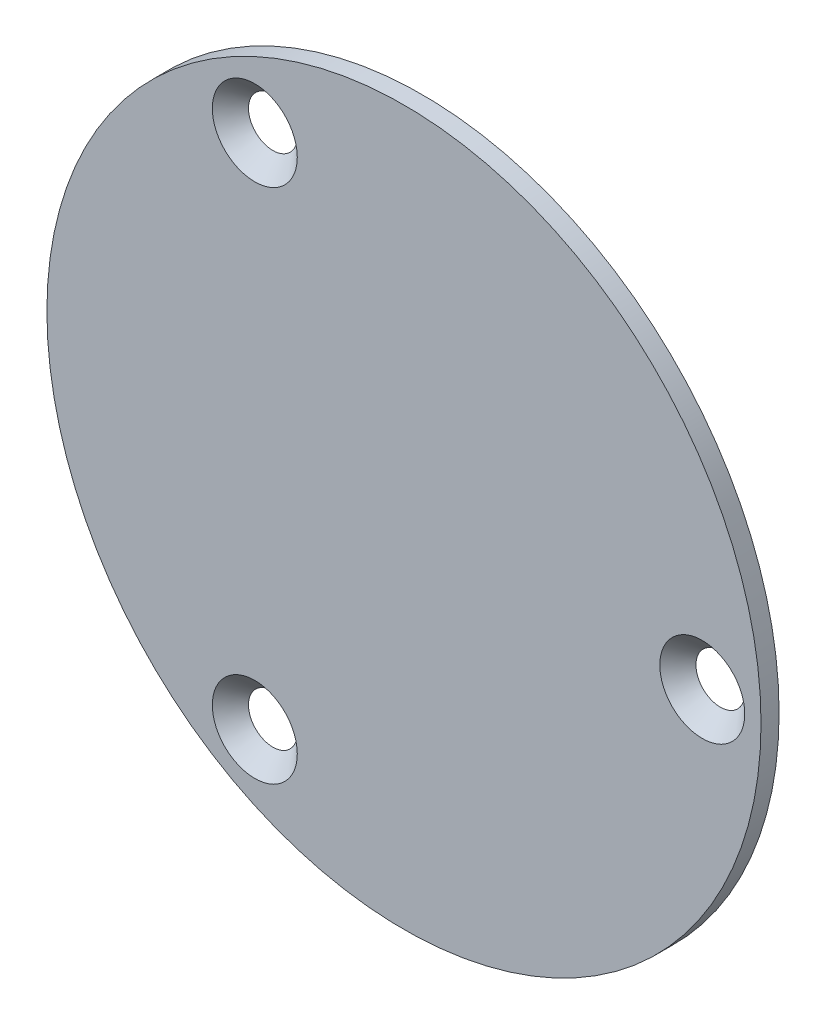
ISO-10303-21;
HEADER;
FILE_DESCRIPTION(('STEP AP214'),'2;1');
FILE_NAME('part.step','',(''),(''),'','','');
FILE_SCHEMA(('AUTOMOTIVE_DESIGN { 1 0 10303 214 1 1 1 1 }'));
ENDSEC;
DATA;
#1=APPLICATION_CONTEXT('core data for automotive mechanical design processes');
#2=APPLICATION_PROTOCOL_DEFINITION('international standard','automotive_design',2000,#1);
#3=PRODUCT_CONTEXT('',#1,'mechanical');
#4=PRODUCT('Part','Part','',(#3));
#5=PRODUCT_RELATED_PRODUCT_CATEGORY('part','',(#4));
#6=PRODUCT_DEFINITION_FORMATION('','',#4);
#7=PRODUCT_DEFINITION_CONTEXT('part definition',#1,'design');
#8=PRODUCT_DEFINITION('design','',#6,#7);
#9=PRODUCT_DEFINITION_SHAPE('','',#8);
#10=(LENGTH_UNIT() NAMED_UNIT(*) SI_UNIT(.MILLI.,.METRE.));
#11=(NAMED_UNIT(*) PLANE_ANGLE_UNIT() SI_UNIT($,.RADIAN.));
#12=(NAMED_UNIT(*) SI_UNIT($,.STERADIAN.) SOLID_ANGLE_UNIT());
#13=UNCERTAINTY_MEASURE_WITH_UNIT(LENGTH_MEASURE(1.E-05),#10,'distance_accuracy_value','');
#14=(GEOMETRIC_REPRESENTATION_CONTEXT(3) GLOBAL_UNCERTAINTY_ASSIGNED_CONTEXT((#13)) GLOBAL_UNIT_ASSIGNED_CONTEXT((#10,
#11,#12)) REPRESENTATION_CONTEXT('',''));
#15=CARTESIAN_POINT('',(0.,0.,0.));
#16=DIRECTION('',(0.,0.,1.));
#17=DIRECTION('',(1.,0.,0.));
#18=AXIS2_PLACEMENT_3D('',#15,#16,#17);
#19=CARTESIAN_POINT('',(0.,0.,2.));
#20=DIRECTION('',(0.,0.,-1.));
#21=DIRECTION('',(-1.,0.,0.));
#22=AXIS2_PLACEMENT_3D('',#19,#20,#21);
#23=CYLINDRICAL_SURFACE('',#22,39.5);
#24=CARTESIAN_POINT('',(0.,0.,2.));
#25=DIRECTION('',(0.,0.,1.));
#26=DIRECTION('',(1.,0.,0.));
#27=AXIS2_PLACEMENT_3D('',#24,#25,#26);
#28=CIRCLE('',#27,39.5);
#29=CARTESIAN_POINT('',(39.5,0.,2.));
#30=VERTEX_POINT('',#29);
#31=EDGE_CURVE('E10',#30,#30,#28,.T.);
#32=ORIENTED_EDGE('',*,*,#31,.F.);
#33=EDGE_LOOP('',(#32));
#34=FACE_BOUND('',#33,.T.);
#35=CARTESIAN_POINT('',(0.,0.,0.));
#36=DIRECTION('',(0.,0.,1.));
#37=DIRECTION('',(1.,0.,0.));
#38=AXIS2_PLACEMENT_3D('',#35,#36,#37);
#39=CIRCLE('',#38,39.5);
#40=CARTESIAN_POINT('',(39.5,0.,0.));
#41=VERTEX_POINT('',#40);
#42=EDGE_CURVE('E42',#41,#41,#39,.T.);
#43=ORIENTED_EDGE('',*,*,#42,.T.);
#44=EDGE_LOOP('',(#43));
#45=FACE_BOUND('',#44,.T.);
#46=ADVANCED_FACE('F35',(#34,#45),#23,.T.);
#47=CARTESIAN_POINT('',(0.,0.,2.));
#48=DIRECTION('',(0.,0.,1.));
#49=DIRECTION('',(1.,0.,0.));
#50=AXIS2_PLACEMENT_3D('',#47,#48,#49);
#51=PLANE('',#50);
#52=CARTESIAN_POINT('',(-16.4999999999997,-28.5788383248866,2.));
#53=DIRECTION('',(0.,0.,1.));
#54=DIRECTION('',(1.,0.,0.));
#55=AXIS2_PLACEMENT_3D('',#52,#53,#54);
#56=CIRCLE('',#55,4.7);
#57=CARTESIAN_POINT('',(-11.7999999999997,-28.5788383248866,2.));
#58=VERTEX_POINT('',#57);
#59=EDGE_CURVE('E66',#58,#58,#56,.T.);
#60=ORIENTED_EDGE('',*,*,#59,.F.);
#61=EDGE_LOOP('',(#60));
#62=FACE_BOUND('',#61,.T.);
#63=CARTESIAN_POINT('',(-16.5000000000001,28.5788383248864,2.));
#64=DIRECTION('',(0.,0.,1.));
#65=DIRECTION('',(1.,0.,0.));
#66=AXIS2_PLACEMENT_3D('',#63,#64,#65);
#67=CIRCLE('',#66,4.7);
#68=CARTESIAN_POINT('',(-11.8000000000001,28.5788383248864,2.));
#69=VERTEX_POINT('',#68);
#70=EDGE_CURVE('E60',#69,#69,#67,.T.);
#71=ORIENTED_EDGE('',*,*,#70,.F.);
#72=EDGE_LOOP('',(#71));
#73=FACE_BOUND('',#72,.T.);
#74=CARTESIAN_POINT('',(33.,0.,2.));
#75=DIRECTION('',(0.,0.,1.));
#76=DIRECTION('',(1.,0.,0.));
#77=AXIS2_PLACEMENT_3D('',#74,#75,#76);
#78=CIRCLE('',#77,4.7);
#79=CARTESIAN_POINT('',(37.7,0.,2.));
#80=VERTEX_POINT('',#79);
#81=EDGE_CURVE('E50',#80,#80,#78,.T.);
#82=ORIENTED_EDGE('',*,*,#81,.F.);
#83=EDGE_LOOP('',(#82));
#84=FACE_BOUND('',#83,.T.);
#85=ORIENTED_EDGE('',*,*,#31,.T.);
#86=EDGE_LOOP('',(#85));
#87=FACE_BOUND('',#86,.T.);
#88=ADVANCED_FACE('F86',(#62,#73,#84,#87),#51,.T.);
#89=CARTESIAN_POINT('',(0.,0.,0.));
#90=DIRECTION('',(0.,0.,1.));
#91=DIRECTION('',(1.,0.,0.));
#92=AXIS2_PLACEMENT_3D('',#89,#90,#91);
#93=PLANE('',#92);
#94=CARTESIAN_POINT('',(-16.4999999999997,-28.5788383248866,0.));
#95=DIRECTION('',(0.,0.,1.));
#96=DIRECTION('',(1.,0.,0.));
#97=AXIS2_PLACEMENT_3D('',#94,#95,#96);
#98=CIRCLE('',#97,2.7);
#99=CARTESIAN_POINT('',(-13.7999999999997,-28.5788383248866,0.));
#100=VERTEX_POINT('',#99);
#101=EDGE_CURVE('E38',#100,#100,#98,.T.);
#102=ORIENTED_EDGE('',*,*,#101,.T.);
#103=EDGE_LOOP('',(#102));
#104=FACE_BOUND('',#103,.T.);
#105=CARTESIAN_POINT('',(-16.5000000000001,28.5788383248864,0.));
#106=DIRECTION('',(0.,0.,1.));
#107=DIRECTION('',(1.,0.,0.));
#108=AXIS2_PLACEMENT_3D('',#105,#106,#107);
#109=CIRCLE('',#108,2.7);
#110=CARTESIAN_POINT('',(-13.8000000000001,28.5788383248864,0.));
#111=VERTEX_POINT('',#110);
#112=EDGE_CURVE('E56',#111,#111,#109,.T.);
#113=ORIENTED_EDGE('',*,*,#112,.T.);
#114=EDGE_LOOP('',(#113));
#115=FACE_BOUND('',#114,.T.);
#116=CARTESIAN_POINT('',(33.,0.,0.));
#117=DIRECTION('',(0.,0.,1.));
#118=DIRECTION('',(1.,0.,0.));
#119=AXIS2_PLACEMENT_3D('',#116,#117,#118);
#120=CIRCLE('',#119,2.7);
#121=CARTESIAN_POINT('',(35.7,0.,0.));
#122=VERTEX_POINT('',#121);
#123=EDGE_CURVE('E47',#122,#122,#120,.T.);
#124=ORIENTED_EDGE('',*,*,#123,.T.);
#125=EDGE_LOOP('',(#124));
#126=FACE_BOUND('',#125,.T.);
#127=ORIENTED_EDGE('',*,*,#42,.F.);
#128=EDGE_LOOP('',(#127));
#129=FACE_BOUND('',#128,.T.);
#130=ADVANCED_FACE('F73',(#104,#115,#126,#129),#93,.F.);
#131=CARTESIAN_POINT('',(33.,0.,2.));
#132=DIRECTION('',(0.,0.,1.));
#133=DIRECTION('',(1.,0.,0.));
#134=AXIS2_PLACEMENT_3D('',#131,#132,#133);
#135=CONICAL_SURFACE('',#134,4.7,0.78539816339745);
#136=ORIENTED_EDGE('',*,*,#81,.T.);
#137=EDGE_LOOP('',(#136));
#138=FACE_BOUND('',#137,.T.);
#139=ORIENTED_EDGE('',*,*,#123,.F.);
#140=EDGE_LOOP('',(#139));
#141=FACE_BOUND('',#140,.T.);
#142=ADVANCED_FACE('F82',(#138,#141),#135,.F.);
#143=CARTESIAN_POINT('',(-16.5000000000001,28.5788383248864,2.));
#144=DIRECTION('',(0.,0.,1.));
#145=DIRECTION('',(1.,0.,0.));
#146=AXIS2_PLACEMENT_3D('',#143,#144,#145);
#147=CONICAL_SURFACE('',#146,4.7,0.785398163397449);
#148=ORIENTED_EDGE('',*,*,#70,.T.);
#149=EDGE_LOOP('',(#148));
#150=FACE_BOUND('',#149,.T.);
#151=ORIENTED_EDGE('',*,*,#112,.F.);
#152=EDGE_LOOP('',(#151));
#153=FACE_BOUND('',#152,.T.);
#154=ADVANCED_FACE('F77',(#150,#153),#147,.F.);
#155=CARTESIAN_POINT('',(-16.4999999999997,-28.5788383248866,2.));
#156=DIRECTION('',(0.,0.,1.));
#157=DIRECTION('',(1.,0.,0.));
#158=AXIS2_PLACEMENT_3D('',#155,#156,#157);
#159=CONICAL_SURFACE('',#158,4.7,0.785398163397449);
#160=ORIENTED_EDGE('',*,*,#59,.T.);
#161=EDGE_LOOP('',(#160));
#162=FACE_BOUND('',#161,.T.);
#163=ORIENTED_EDGE('',*,*,#101,.F.);
#164=EDGE_LOOP('',(#163));
#165=FACE_BOUND('',#164,.T.);
#166=ADVANCED_FACE('F75',(#162,#165),#159,.F.);
#167=CLOSED_SHELL('',(#46,#88,#130,#142,#154,#166));
#168=MANIFOLD_SOLID_BREP('B2',#167);
#169=ADVANCED_BREP_SHAPE_REPRESENTATION('',(#18,#168),#14);
#170=SHAPE_DEFINITION_REPRESENTATION(#9,#169);
ENDSEC;
END-ISO-10303-21;
